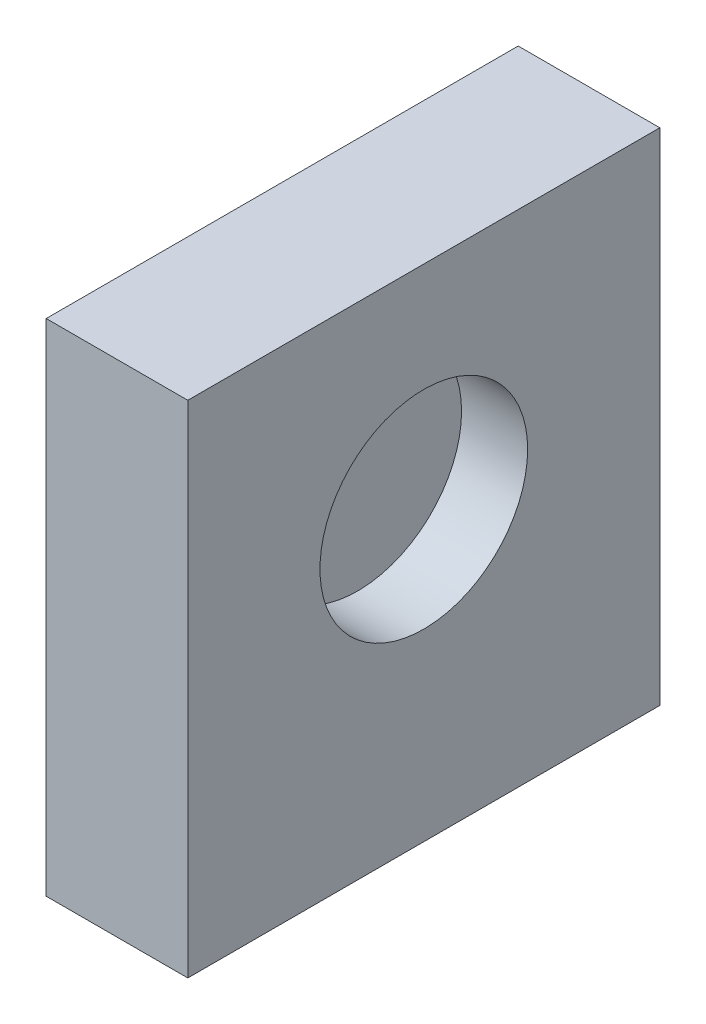
ISO-10303-21;
HEADER;
FILE_DESCRIPTION(('STEP AP214'),'2;1');
FILE_NAME('part.step','',(''),(''),'','','');
FILE_SCHEMA(('AUTOMOTIVE_DESIGN { 1 0 10303 214 1 1 1 1 }'));
ENDSEC;
DATA;
#1=APPLICATION_CONTEXT('core data for automotive mechanical design processes');
#2=APPLICATION_PROTOCOL_DEFINITION('international standard','automotive_design',2000,#1);
#3=PRODUCT_CONTEXT('',#1,'mechanical');
#4=PRODUCT('Part','Part','',(#3));
#5=PRODUCT_RELATED_PRODUCT_CATEGORY('part','',(#4));
#6=PRODUCT_DEFINITION_FORMATION('','',#4);
#7=PRODUCT_DEFINITION_CONTEXT('part definition',#1,'design');
#8=PRODUCT_DEFINITION('design','',#6,#7);
#9=PRODUCT_DEFINITION_SHAPE('','',#8);
#10=(LENGTH_UNIT() NAMED_UNIT(*) SI_UNIT(.MILLI.,.METRE.));
#11=(NAMED_UNIT(*) PLANE_ANGLE_UNIT() SI_UNIT($,.RADIAN.));
#12=(NAMED_UNIT(*) SI_UNIT($,.STERADIAN.) SOLID_ANGLE_UNIT());
#13=UNCERTAINTY_MEASURE_WITH_UNIT(LENGTH_MEASURE(1.E-05),#10,'distance_accuracy_value','');
#14=(GEOMETRIC_REPRESENTATION_CONTEXT(3) GLOBAL_UNCERTAINTY_ASSIGNED_CONTEXT((#13)) GLOBAL_UNIT_ASSIGNED_CONTEXT((#10,
#11,#12)) REPRESENTATION_CONTEXT('',''));
#15=CARTESIAN_POINT('',(0.,0.,0.));
#16=DIRECTION('',(0.,0.,1.));
#17=DIRECTION('',(1.,0.,0.));
#18=AXIS2_PLACEMENT_3D('',#15,#16,#17);
#19=CARTESIAN_POINT('',(15.,-26.5,-25.));
#20=DIRECTION('',(0.,0.,1.));
#21=DIRECTION('',(1.,0.,0.));
#22=AXIS2_PLACEMENT_3D('',#19,#20,#21);
#23=PLANE('',#22);
#24=DIRECTION('',(0.,1.,0.));
#25=VECTOR('',#24,1.);
#26=CARTESIAN_POINT('',(0.,-26.5,-25.));
#27=LINE('',#26,#25);
#28=CARTESIAN_POINT('',(0.,-26.5,-25.));
#29=VERTEX_POINT('',#28);
#30=CARTESIAN_POINT('',(0.,26.5,-25.));
#31=VERTEX_POINT('',#30);
#32=EDGE_CURVE('E98',#29,#31,#27,.T.);
#33=ORIENTED_EDGE('',*,*,#32,.T.);
#34=DIRECTION('',(-1.,0.,0.));
#35=VECTOR('',#34,1.);
#36=CARTESIAN_POINT('',(15.,26.5,-25.));
#37=LINE('',#36,#35);
#38=CARTESIAN_POINT('',(15.,26.5,-25.));
#39=VERTEX_POINT('',#38);
#40=EDGE_CURVE('E11',#39,#31,#37,.T.);
#41=ORIENTED_EDGE('',*,*,#40,.F.);
#42=DIRECTION('',(0.,1.,0.));
#43=VECTOR('',#42,1.);
#44=CARTESIAN_POINT('',(15.,-26.5,-25.));
#45=LINE('',#44,#43);
#46=CARTESIAN_POINT('',(15.,-26.5,-25.));
#47=VERTEX_POINT('',#46);
#48=EDGE_CURVE('E86',#47,#39,#45,.T.);
#49=ORIENTED_EDGE('',*,*,#48,.F.);
#50=DIRECTION('',(-1.,0.,0.));
#51=VECTOR('',#50,1.);
#52=CARTESIAN_POINT('',(15.,-26.5,-25.));
#53=LINE('',#52,#51);
#54=EDGE_CURVE('E94',#47,#29,#53,.T.);
#55=ORIENTED_EDGE('',*,*,#54,.T.);
#56=EDGE_LOOP('',(#33,#41,#49,#55));
#57=FACE_BOUND('',#56,.T.);
#58=ADVANCED_FACE('F35',(#57),#23,.F.);
#59=CARTESIAN_POINT('',(15.,26.5,25.));
#60=DIRECTION('',(0.,-1.,0.));
#61=DIRECTION('',(0.,0.,-1.));
#62=AXIS2_PLACEMENT_3D('',#59,#60,#61);
#63=PLANE('',#62);
#64=DIRECTION('',(0.,0.,1.));
#65=VECTOR('',#64,1.);
#66=CARTESIAN_POINT('',(0.,26.5,25.));
#67=LINE('',#66,#65);
#68=CARTESIAN_POINT('',(0.,26.5,25.));
#69=VERTEX_POINT('',#68);
#70=EDGE_CURVE('E90',#31,#69,#67,.T.);
#71=ORIENTED_EDGE('',*,*,#70,.T.);
#72=DIRECTION('',(-1.,0.,0.));
#73=VECTOR('',#72,1.);
#74=CARTESIAN_POINT('',(15.,26.5,25.));
#75=LINE('',#74,#73);
#76=CARTESIAN_POINT('',(15.,26.5,25.));
#77=VERTEX_POINT('',#76);
#78=EDGE_CURVE('E43',#77,#69,#75,.T.);
#79=ORIENTED_EDGE('',*,*,#78,.F.);
#80=DIRECTION('',(0.,0.,1.));
#81=VECTOR('',#80,1.);
#82=CARTESIAN_POINT('',(15.,26.5,25.));
#83=LINE('',#82,#81);
#84=EDGE_CURVE('E81',#39,#77,#83,.T.);
#85=ORIENTED_EDGE('',*,*,#84,.F.);
#86=ORIENTED_EDGE('',*,*,#40,.T.);
#87=EDGE_LOOP('',(#71,#79,#85,#86));
#88=FACE_BOUND('',#87,.T.);
#89=ADVANCED_FACE('F89',(#88),#63,.F.);
#90=CARTESIAN_POINT('',(15.,-26.5,25.));
#91=DIRECTION('',(0.,0.,-1.));
#92=DIRECTION('',(-1.,0.,0.));
#93=AXIS2_PLACEMENT_3D('',#90,#91,#92);
#94=PLANE('',#93);
#95=DIRECTION('',(0.,-1.,0.));
#96=VECTOR('',#95,1.);
#97=CARTESIAN_POINT('',(0.,-26.5,25.));
#98=LINE('',#97,#96);
#99=CARTESIAN_POINT('',(0.,-26.5,25.));
#100=VERTEX_POINT('',#99);
#101=EDGE_CURVE('E68',#69,#100,#98,.T.);
#102=ORIENTED_EDGE('',*,*,#101,.T.);
#103=DIRECTION('',(-1.,0.,0.));
#104=VECTOR('',#103,1.);
#105=CARTESIAN_POINT('',(15.,-26.5,25.));
#106=LINE('',#105,#104);
#107=CARTESIAN_POINT('',(15.,-26.5,25.));
#108=VERTEX_POINT('',#107);
#109=EDGE_CURVE('E91',#108,#100,#106,.T.);
#110=ORIENTED_EDGE('',*,*,#109,.F.);
#111=DIRECTION('',(0.,-1.,0.));
#112=VECTOR('',#111,1.);
#113=CARTESIAN_POINT('',(15.,-26.5,25.));
#114=LINE('',#113,#112);
#115=EDGE_CURVE('E84',#77,#108,#114,.T.);
#116=ORIENTED_EDGE('',*,*,#115,.F.);
#117=ORIENTED_EDGE('',*,*,#78,.T.);
#118=EDGE_LOOP('',(#102,#110,#116,#117));
#119=FACE_BOUND('',#118,.T.);
#120=ADVANCED_FACE('F92',(#119),#94,.F.);
#121=CARTESIAN_POINT('',(15.,-26.5,25.));
#122=DIRECTION('',(0.,1.,0.));
#123=DIRECTION('',(0.,0.,1.));
#124=AXIS2_PLACEMENT_3D('',#121,#122,#123);
#125=PLANE('',#124);
#126=DIRECTION('',(0.,0.,-1.));
#127=VECTOR('',#126,1.);
#128=CARTESIAN_POINT('',(0.,-26.5,25.));
#129=LINE('',#128,#127);
#130=EDGE_CURVE('E74',#100,#29,#129,.T.);
#131=ORIENTED_EDGE('',*,*,#130,.T.);
#132=ORIENTED_EDGE('',*,*,#54,.F.);
#133=DIRECTION('',(0.,0.,-1.));
#134=VECTOR('',#133,1.);
#135=CARTESIAN_POINT('',(15.,-26.5,25.));
#136=LINE('',#135,#134);
#137=EDGE_CURVE('E51',#108,#47,#136,.T.);
#138=ORIENTED_EDGE('',*,*,#137,.F.);
#139=ORIENTED_EDGE('',*,*,#109,.T.);
#140=EDGE_LOOP('',(#131,#132,#138,#139));
#141=FACE_BOUND('',#140,.T.);
#142=ADVANCED_FACE('F106',(#141),#125,.F.);
#143=CARTESIAN_POINT('',(15.,0.,0.));
#144=DIRECTION('',(-1.,0.,0.));
#145=DIRECTION('',(0.,0.,1.));
#146=AXIS2_PLACEMENT_3D('',#143,#144,#145);
#147=PLANE('',#146);
#148=CARTESIAN_POINT('',(15.,4.,0.));
#149=DIRECTION('',(1.,0.,0.));
#150=DIRECTION('',(0.,0.,-1.));
#151=AXIS2_PLACEMENT_3D('',#148,#149,#150);
#152=CIRCLE('',#151,11.);
#153=CARTESIAN_POINT('',(15.,4.,-11.));
#154=VERTEX_POINT('',#153);
#155=EDGE_CURVE('E112',#154,#154,#152,.T.);
#156=ORIENTED_EDGE('',*,*,#155,.F.);
#157=EDGE_LOOP('',(#156));
#158=FACE_BOUND('',#157,.T.);
#159=ORIENTED_EDGE('',*,*,#48,.T.);
#160=ORIENTED_EDGE('',*,*,#84,.T.);
#161=ORIENTED_EDGE('',*,*,#115,.T.);
#162=ORIENTED_EDGE('',*,*,#137,.T.);
#163=EDGE_LOOP('',(#159,#160,#161,#162));
#164=FACE_BOUND('',#163,.T.);
#165=ADVANCED_FACE('F82',(#158,#164),#147,.F.);
#166=CARTESIAN_POINT('',(0.,0.,0.));
#167=DIRECTION('',(-1.,0.,0.));
#168=DIRECTION('',(0.,0.,1.));
#169=AXIS2_PLACEMENT_3D('',#166,#167,#168);
#170=PLANE('',#169);
#171=ORIENTED_EDGE('',*,*,#32,.F.);
#172=ORIENTED_EDGE('',*,*,#130,.F.);
#173=ORIENTED_EDGE('',*,*,#101,.F.);
#174=ORIENTED_EDGE('',*,*,#70,.F.);
#175=EDGE_LOOP('',(#171,#172,#173,#174));
#176=FACE_BOUND('',#175,.T.);
#177=ADVANCED_FACE('F109',(#176),#170,.T.);
#178=CARTESIAN_POINT('',(8.,4.,0.));
#179=DIRECTION('',(1.,0.,0.));
#180=DIRECTION('',(0.,0.,-1.));
#181=AXIS2_PLACEMENT_3D('',#178,#179,#180);
#182=CYLINDRICAL_SURFACE('',#181,11.);
#183=CARTESIAN_POINT('',(8.,4.,0.));
#184=DIRECTION('',(1.,0.,0.));
#185=DIRECTION('',(0.,0.,-1.));
#186=AXIS2_PLACEMENT_3D('',#183,#184,#185);
#187=CIRCLE('',#186,11.);
#188=CARTESIAN_POINT('',(8.,4.,-11.));
#189=VERTEX_POINT('',#188);
#190=EDGE_CURVE('E101',#189,#189,#187,.T.);
#191=ORIENTED_EDGE('',*,*,#190,.F.);
#192=EDGE_LOOP('',(#191));
#193=FACE_BOUND('',#192,.T.);
#194=ORIENTED_EDGE('',*,*,#155,.T.);
#195=EDGE_LOOP('',(#194));
#196=FACE_BOUND('',#195,.T.);
#197=ADVANCED_FACE('F120',(#193,#196),#182,.F.);
#198=CARTESIAN_POINT('',(8.,4.,0.));
#199=DIRECTION('',(1.,0.,0.));
#200=DIRECTION('',(0.,0.,-1.));
#201=AXIS2_PLACEMENT_3D('',#198,#199,#200);
#202=PLANE('',#201);
#203=ORIENTED_EDGE('',*,*,#190,.T.);
#204=EDGE_LOOP('',(#203));
#205=FACE_BOUND('',#204,.T.);
#206=ADVANCED_FACE('F118',(#205),#202,.T.);
#207=CLOSED_SHELL('',(#58,#89,#120,#142,#165,#177,#197,#206));
#208=MANIFOLD_SOLID_BREP('B2',#207);
#209=ADVANCED_BREP_SHAPE_REPRESENTATION('',(#18,#208),#14);
#210=SHAPE_DEFINITION_REPRESENTATION(#9,#209);
ENDSEC;
END-ISO-10303-21;
